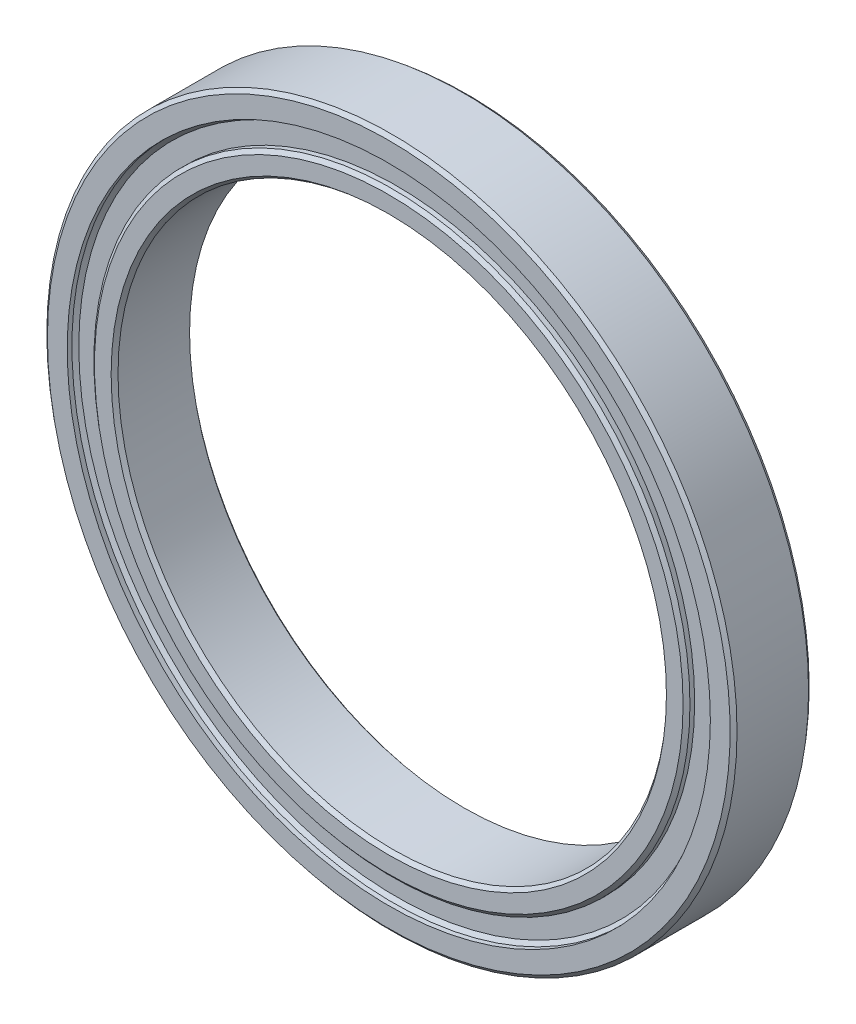
ISO-10303-21;
HEADER;
FILE_DESCRIPTION(('STEP AP214'),'2;1');
FILE_NAME('part.step','',(''),(''),'','','');
FILE_SCHEMA(('AUTOMOTIVE_DESIGN { 1 0 10303 214 1 1 1 1 }'));
ENDSEC;
DATA;
#1=APPLICATION_CONTEXT('core data for automotive mechanical design processes');
#2=APPLICATION_PROTOCOL_DEFINITION('international standard','automotive_design',2000,#1);
#3=PRODUCT_CONTEXT('',#1,'mechanical');
#4=PRODUCT('Part','Part','',(#3));
#5=PRODUCT_RELATED_PRODUCT_CATEGORY('part','',(#4));
#6=PRODUCT_DEFINITION_FORMATION('','',#4);
#7=PRODUCT_DEFINITION_CONTEXT('part definition',#1,'design');
#8=PRODUCT_DEFINITION('design','',#6,#7);
#9=PRODUCT_DEFINITION_SHAPE('','',#8);
#10=(LENGTH_UNIT() NAMED_UNIT(*) SI_UNIT(.MILLI.,.METRE.));
#11=(NAMED_UNIT(*) PLANE_ANGLE_UNIT() SI_UNIT($,.RADIAN.));
#12=(NAMED_UNIT(*) SI_UNIT($,.STERADIAN.) SOLID_ANGLE_UNIT());
#13=UNCERTAINTY_MEASURE_WITH_UNIT(LENGTH_MEASURE(1.E-05),#10,'distance_accuracy_value','');
#14=(GEOMETRIC_REPRESENTATION_CONTEXT(3) GLOBAL_UNCERTAINTY_ASSIGNED_CONTEXT((#13)) GLOBAL_UNIT_ASSIGNED_CONTEXT((#10,
#11,#12)) REPRESENTATION_CONTEXT('',''));
#15=CARTESIAN_POINT('',(0.,0.,0.));
#16=DIRECTION('',(0.,0.,1.));
#17=DIRECTION('',(1.,0.,0.));
#18=AXIS2_PLACEMENT_3D('',#15,#16,#17);
#19=CARTESIAN_POINT('',(0.,0.,0.));
#20=DIRECTION('',(0.,0.,1.));
#21=DIRECTION('',(1.,0.,0.));
#22=AXIS2_PLACEMENT_3D('',#19,#20,#21);
#23=PLANE('',#22);
#24=CARTESIAN_POINT('',(0.,0.,0.));
#25=DIRECTION('',(0.,0.,1.));
#26=DIRECTION('',(1.,0.,0.));
#27=AXIS2_PLACEMENT_3D('',#24,#25,#26);
#28=CIRCLE('',#27,17.7383507185188);
#29=CARTESIAN_POINT('',(17.7383507185188,0.,0.));
#30=VERTEX_POINT('',#29);
#31=EDGE_CURVE('E60',#30,#30,#28,.T.);
#32=ORIENTED_EDGE('',*,*,#31,.T.);
#33=EDGE_LOOP('',(#32));
#34=FACE_BOUND('',#33,.T.);
#35=CARTESIAN_POINT('',(0.,0.,0.));
#36=DIRECTION('',(0.,0.,1.));
#37=DIRECTION('',(1.,0.,0.));
#38=AXIS2_PLACEMENT_3D('',#35,#36,#37);
#39=CIRCLE('',#38,18.8);
#40=CARTESIAN_POINT('',(18.8,0.,0.));
#41=VERTEX_POINT('',#40);
#42=EDGE_CURVE('E63',#41,#41,#39,.F.);
#43=ORIENTED_EDGE('',*,*,#42,.T.);
#44=EDGE_LOOP('',(#43));
#45=FACE_BOUND('',#44,.T.);
#46=ADVANCED_FACE('F33',(#34,#45),#23,.F.);
#47=CARTESIAN_POINT('',(0.,0.,5.));
#48=DIRECTION('',(0.,0.,1.));
#49=DIRECTION('',(1.,0.,0.));
#50=AXIS2_PLACEMENT_3D('',#47,#48,#49);
#51=PLANE('',#50);
#52=CARTESIAN_POINT('',(0.,0.,5.));
#53=DIRECTION('',(0.,0.,1.));
#54=DIRECTION('',(1.,0.,0.));
#55=AXIS2_PLACEMENT_3D('',#52,#53,#54);
#56=CIRCLE('',#55,18.7616492814812);
#57=CARTESIAN_POINT('',(18.7616492814812,0.,5.));
#58=VERTEX_POINT('',#57);
#59=EDGE_CURVE('E84',#58,#58,#56,.T.);
#60=ORIENTED_EDGE('',*,*,#59,.T.);
#61=EDGE_LOOP('',(#60));
#62=FACE_BOUND('',#61,.T.);
#63=CARTESIAN_POINT('',(0.,0.,5.));
#64=DIRECTION('',(0.,0.,1.));
#65=DIRECTION('',(1.,0.,0.));
#66=AXIS2_PLACEMENT_3D('',#63,#64,#65);
#67=CIRCLE('',#66,17.7);
#68=CARTESIAN_POINT('',(17.7,0.,5.));
#69=VERTEX_POINT('',#68);
#70=EDGE_CURVE('E87',#69,#69,#67,.F.);
#71=ORIENTED_EDGE('',*,*,#70,.T.);
#72=EDGE_LOOP('',(#71));
#73=FACE_BOUND('',#72,.T.);
#74=ADVANCED_FACE('F121',(#62,#73),#51,.T.);
#75=CARTESIAN_POINT('',(0.,0.,5.));
#76=DIRECTION('',(0.,0.,1.));
#77=DIRECTION('',(1.,0.,0.));
#78=AXIS2_PLACEMENT_3D('',#75,#76,#77);
#79=CIRCLE('',#78,21.7616492814812);
#80=CARTESIAN_POINT('',(-21.7616492814812,0.,5.));
#81=VERTEX_POINT('',#80);
#82=EDGE_CURVE('E72',#81,#81,#79,.T.);
#83=ORIENTED_EDGE('',*,*,#82,.T.);
#84=EDGE_LOOP('',(#83));
#85=FACE_BOUND('',#84,.T.);
#86=CARTESIAN_POINT('',(0.,0.,5.));
#87=DIRECTION('',(0.,0.,1.));
#88=DIRECTION('',(1.,0.,0.));
#89=AXIS2_PLACEMENT_3D('',#86,#87,#88);
#90=CIRCLE('',#89,20.5);
#91=CARTESIAN_POINT('',(20.5,0.,5.));
#92=VERTEX_POINT('',#91);
#93=EDGE_CURVE('E90',#92,#92,#90,.T.);
#94=ORIENTED_EDGE('',*,*,#93,.F.);
#95=EDGE_LOOP('',(#94));
#96=FACE_BOUND('',#95,.T.);
#97=ADVANCED_FACE('F128',(#85,#96),#51,.T.);
#98=CARTESIAN_POINT('',(0.,0.,0.));
#99=DIRECTION('',(0.,0.,1.));
#100=DIRECTION('',(1.,0.,0.));
#101=AXIS2_PLACEMENT_3D('',#98,#99,#100);
#102=CIRCLE('',#101,20.7383507185188);
#103=CARTESIAN_POINT('',(20.7383507185188,0.,0.));
#104=VERTEX_POINT('',#103);
#105=EDGE_CURVE('E45',#104,#104,#102,.T.);
#106=ORIENTED_EDGE('',*,*,#105,.T.);
#107=EDGE_LOOP('',(#106));
#108=FACE_BOUND('',#107,.T.);
#109=CARTESIAN_POINT('',(0.,0.,0.));
#110=DIRECTION('',(0.,0.,1.));
#111=DIRECTION('',(1.,0.,0.));
#112=AXIS2_PLACEMENT_3D('',#109,#110,#111);
#113=CIRCLE('',#112,21.8);
#114=CARTESIAN_POINT('',(21.8,0.,0.));
#115=VERTEX_POINT('',#114);
#116=EDGE_CURVE('E49',#115,#115,#113,.F.);
#117=ORIENTED_EDGE('',*,*,#116,.T.);
#118=EDGE_LOOP('',(#117));
#119=FACE_BOUND('',#118,.T.);
#120=ADVANCED_FACE('F124',(#108,#119),#23,.F.);
#121=CARTESIAN_POINT('',(0.,0.,5.));
#122=DIRECTION('',(0.,0.,-1.));
#123=DIRECTION('',(-1.,0.,0.));
#124=AXIS2_PLACEMENT_3D('',#121,#122,#123);
#125=CYLINDRICAL_SURFACE('',#124,22.);
#126=CARTESIAN_POINT('',(0.,0.,0.23835071851883));
#127=DIRECTION('',(0.,0.,1.));
#128=DIRECTION('',(1.,0.,0.));
#129=AXIS2_PLACEMENT_3D('',#126,#127,#128);
#130=CIRCLE('',#129,22.);
#131=CARTESIAN_POINT('',(22.,0.,0.23835071851883));
#132=VERTEX_POINT('',#131);
#133=EDGE_CURVE('E10',#132,#132,#130,.T.);
#134=ORIENTED_EDGE('',*,*,#133,.T.);
#135=EDGE_LOOP('',(#134));
#136=FACE_BOUND('',#135,.T.);
#137=CARTESIAN_POINT('',(0.,0.,4.80000000000001));
#138=DIRECTION('',(0.,0.,1.));
#139=DIRECTION('',(1.,0.,0.));
#140=AXIS2_PLACEMENT_3D('',#137,#138,#139);
#141=CIRCLE('',#140,22.);
#142=CARTESIAN_POINT('',(-22.,0.,4.80000000000001));
#143=VERTEX_POINT('',#142);
#144=EDGE_CURVE('E69',#143,#143,#141,.F.);
#145=ORIENTED_EDGE('',*,*,#144,.T.);
#146=EDGE_LOOP('',(#145));
#147=FACE_BOUND('',#146,.T.);
#148=ADVANCED_FACE('F134',(#136,#147),#125,.T.);
#149=CARTESIAN_POINT('',(0.,0.,5.));
#150=DIRECTION('',(0.,0.,-1.));
#151=DIRECTION('',(-1.,0.,0.));
#152=AXIS2_PLACEMENT_3D('',#149,#150,#151);
#153=CYLINDRICAL_SURFACE('',#152,17.5);
#154=CARTESIAN_POINT('',(0.,0.,0.199999999999997));
#155=DIRECTION('',(0.,0.,1.));
#156=DIRECTION('',(1.,0.,0.));
#157=AXIS2_PLACEMENT_3D('',#154,#155,#156);
#158=CIRCLE('',#157,17.5);
#159=CARTESIAN_POINT('',(17.5,0.,0.199999999999997));
#160=VERTEX_POINT('',#159);
#161=EDGE_CURVE('E57',#160,#160,#158,.F.);
#162=ORIENTED_EDGE('',*,*,#161,.T.);
#163=EDGE_LOOP('',(#162));
#164=FACE_BOUND('',#163,.T.);
#165=CARTESIAN_POINT('',(0.,0.,4.76164928148117));
#166=DIRECTION('',(0.,0.,1.));
#167=DIRECTION('',(1.,0.,0.));
#168=AXIS2_PLACEMENT_3D('',#165,#166,#167);
#169=CIRCLE('',#168,17.5);
#170=CARTESIAN_POINT('',(17.5,0.,4.76164928148117));
#171=VERTEX_POINT('',#170);
#172=EDGE_CURVE('E66',#171,#171,#169,.T.);
#173=ORIENTED_EDGE('',*,*,#172,.T.);
#174=EDGE_LOOP('',(#173));
#175=FACE_BOUND('',#174,.T.);
#176=ADVANCED_FACE('F140',(#164,#175),#153,.F.);
#177=CARTESIAN_POINT('',(0.,0.,4.5));
#178=DIRECTION('',(0.,0.,1.));
#179=DIRECTION('',(1.,0.,0.));
#180=AXIS2_PLACEMENT_3D('',#177,#178,#179);
#181=CYLINDRICAL_SURFACE('',#180,20.5);
#182=CARTESIAN_POINT('',(0.,0.,4.7));
#183=DIRECTION('',(0.,0.,1.));
#184=DIRECTION('',(1.,0.,0.));
#185=AXIS2_PLACEMENT_3D('',#182,#183,#184);
#186=CIRCLE('',#185,20.5);
#187=CARTESIAN_POINT('',(20.5,0.,4.7));
#188=VERTEX_POINT('',#187);
#189=EDGE_CURVE('E75',#188,#188,#186,.F.);
#190=ORIENTED_EDGE('',*,*,#189,.T.);
#191=EDGE_LOOP('',(#190));
#192=FACE_BOUND('',#191,.T.);
#193=ORIENTED_EDGE('',*,*,#93,.T.);
#194=EDGE_LOOP('',(#193));
#195=FACE_BOUND('',#194,.T.);
#196=ADVANCED_FACE('F212',(#192,#195),#181,.F.);
#197=CARTESIAN_POINT('',(0.,0.,4.5));
#198=DIRECTION('',(0.,0.,1.));
#199=DIRECTION('',(1.,0.,0.));
#200=AXIS2_PLACEMENT_3D('',#197,#198,#199);
#201=PLANE('',#200);
#202=CARTESIAN_POINT('',(0.,0.,4.5));
#203=DIRECTION('',(0.,0.,1.));
#204=DIRECTION('',(1.,0.,0.));
#205=AXIS2_PLACEMENT_3D('',#202,#203,#204);
#206=CIRCLE('',#205,20.2616492814812);
#207=CARTESIAN_POINT('',(20.2616492814812,0.,4.5));
#208=VERTEX_POINT('',#207);
#209=EDGE_CURVE('E78',#208,#208,#206,.T.);
#210=ORIENTED_EDGE('',*,*,#209,.T.);
#211=EDGE_LOOP('',(#210));
#212=FACE_BOUND('',#211,.T.);
#213=CARTESIAN_POINT('',(0.,0.,4.5));
#214=DIRECTION('',(0.,0.,1.));
#215=DIRECTION('',(1.,0.,0.));
#216=AXIS2_PLACEMENT_3D('',#213,#214,#215);
#217=CIRCLE('',#216,19.);
#218=CARTESIAN_POINT('',(19.,0.,4.5));
#219=VERTEX_POINT('',#218);
#220=EDGE_CURVE('E93',#219,#219,#217,.T.);
#221=ORIENTED_EDGE('',*,*,#220,.F.);
#222=EDGE_LOOP('',(#221));
#223=FACE_BOUND('',#222,.T.);
#224=ADVANCED_FACE('F200',(#212,#223),#201,.T.);
#225=CARTESIAN_POINT('',(0.,0.,4.5));
#226=DIRECTION('',(0.,0.,1.));
#227=DIRECTION('',(1.,0.,0.));
#228=AXIS2_PLACEMENT_3D('',#225,#226,#227);
#229=CYLINDRICAL_SURFACE('',#228,19.);
#230=CARTESIAN_POINT('',(0.,0.,4.8));
#231=DIRECTION('',(0.,0.,1.));
#232=DIRECTION('',(1.,0.,0.));
#233=AXIS2_PLACEMENT_3D('',#230,#231,#232);
#234=CIRCLE('',#233,19.);
#235=CARTESIAN_POINT('',(19.,0.,4.8));
#236=VERTEX_POINT('',#235);
#237=EDGE_CURVE('E81',#236,#236,#234,.F.);
#238=ORIENTED_EDGE('',*,*,#237,.T.);
#239=EDGE_LOOP('',(#238));
#240=FACE_BOUND('',#239,.T.);
#241=ORIENTED_EDGE('',*,*,#220,.T.);
#242=EDGE_LOOP('',(#241));
#243=FACE_BOUND('',#242,.T.);
#244=ADVANCED_FACE('F195',(#240,#243),#229,.T.);
#245=CARTESIAN_POINT('',(0.,0.,5.));
#246=DIRECTION('',(0.,0.,-1.));
#247=DIRECTION('',(-1.,0.,0.));
#248=AXIS2_PLACEMENT_3D('',#245,#246,#247);
#249=CONICAL_SURFACE('',#248,18.7616492814812,0.872664625997171);
#250=ORIENTED_EDGE('',*,*,#237,.F.);
#251=EDGE_LOOP('',(#250));
#252=FACE_BOUND('',#251,.T.);
#253=ORIENTED_EDGE('',*,*,#59,.F.);
#254=EDGE_LOOP('',(#253));
#255=FACE_BOUND('',#254,.T.);
#256=ADVANCED_FACE('F190',(#252,#255),#249,.T.);
#257=CARTESIAN_POINT('',(0.,0.,4.5));
#258=DIRECTION('',(0.,0.,1.));
#259=DIRECTION('',(1.,0.,0.));
#260=AXIS2_PLACEMENT_3D('',#257,#258,#259);
#261=CONICAL_SURFACE('',#260,20.2616492814812,0.872664625997171);
#262=ORIENTED_EDGE('',*,*,#189,.F.);
#263=EDGE_LOOP('',(#262));
#264=FACE_BOUND('',#263,.T.);
#265=ORIENTED_EDGE('',*,*,#209,.F.);
#266=EDGE_LOOP('',(#265));
#267=FACE_BOUND('',#266,.T.);
#268=ADVANCED_FACE('F183',(#264,#267),#261,.F.);
#269=CARTESIAN_POINT('',(0.,0.,5.));
#270=DIRECTION('',(0.,0.,-1.));
#271=DIRECTION('',(-1.,0.,0.));
#272=AXIS2_PLACEMENT_3D('',#269,#270,#271);
#273=CONICAL_SURFACE('',#272,21.7616492814812,0.872664625997189);
#274=CARTESIAN_POINT('',(-22.,0.,4.80000000000001));
#275=CARTESIAN_POINT('',(-21.9975171800154,0.,4.80208333333335));
#276=CARTESIAN_POINT('',(-21.9950343600309,0.,4.80416666666668));
#277=CARTESIAN_POINT('',(-21.9900687200617,0.,4.80833333333334));
#278=CARTESIAN_POINT('',(-21.9875859000771,0.,4.81041666666668));
#279=CARTESIAN_POINT('',(-21.982620260108,0.,4.81458333333334));
#280=CARTESIAN_POINT('',(-21.9801374401234,0.,4.81666666666668));
#281=CARTESIAN_POINT('',(-21.9751718001543,0.,4.82083333333334));
#282=CARTESIAN_POINT('',(-21.9726889801697,0.,4.82291666666668));
#283=CARTESIAN_POINT('',(-21.9677233402006,0.,4.82708333333334));
#284=CARTESIAN_POINT('',(-21.965240520216,0.,4.82916666666668));
#285=CARTESIAN_POINT('',(-21.9602748802469,0.,4.83333333333334));
#286=CARTESIAN_POINT('',(-21.9577920602623,0.,4.83541666666668));
#287=CARTESIAN_POINT('',(-21.9528264202931,0.,4.83958333333334));
#288=CARTESIAN_POINT('',(-21.9503436003086,0.,4.84166666666668));
#289=CARTESIAN_POINT('',(-21.9453779603394,0.,4.84583333333334));
#290=CARTESIAN_POINT('',(-21.9428951403549,0.,4.84791666666668));
#291=CARTESIAN_POINT('',(-21.9379295003857,0.,4.85208333333334));
#292=CARTESIAN_POINT('',(-21.9354466804011,0.,4.85416666666667));
#293=CARTESIAN_POINT('',(-21.930481040432,0.,4.85833333333334));
#294=CARTESIAN_POINT('',(-21.9279982204474,0.,4.86041666666667));
#295=CARTESIAN_POINT('',(-21.9230325804783,0.,4.86458333333334));
#296=CARTESIAN_POINT('',(-21.9205497604937,0.,4.86666666666667));
#297=CARTESIAN_POINT('',(-21.9155841205246,0.,4.87083333333334));
#298=CARTESIAN_POINT('',(-21.91310130054,0.,4.87291666666667));
#299=CARTESIAN_POINT('',(-21.9081356605709,0.,4.87708333333334));
#300=CARTESIAN_POINT('',(-21.9056528405863,0.,4.87916666666667));
#301=CARTESIAN_POINT('',(-21.9006872006171,0.,4.88333333333334));
#302=CARTESIAN_POINT('',(-21.8982043806326,0.,4.88541666666667));
#303=CARTESIAN_POINT('',(-21.8932387406634,0.,4.88958333333334));
#304=CARTESIAN_POINT('',(-21.8907559206789,0.,4.89166666666667));
#305=CARTESIAN_POINT('',(-21.8857902807097,0.,4.89583333333334));
#306=CARTESIAN_POINT('',(-21.8833074607251,0.,4.89791666666667));
#307=CARTESIAN_POINT('',(-21.878341820756,0.,4.90208333333334));
#308=CARTESIAN_POINT('',(-21.8758590007714,0.,4.90416666666667));
#309=CARTESIAN_POINT('',(-21.8708933608023,0.,4.90833333333334));
#310=CARTESIAN_POINT('',(-21.8684105408177,0.,4.91041666666667));
#311=CARTESIAN_POINT('',(-21.8634449008486,0.,4.91458333333334));
#312=CARTESIAN_POINT('',(-21.860962080864,0.,4.91666666666667));
#313=CARTESIAN_POINT('',(-21.8559964408949,0.,4.92083333333334));
#314=CARTESIAN_POINT('',(-21.8535136209103,0.,4.92291666666667));
#315=CARTESIAN_POINT('',(-21.8485479809412,0.,4.92708333333334));
#316=CARTESIAN_POINT('',(-21.8460651609566,0.,4.92916666666667));
#317=CARTESIAN_POINT('',(-21.8410995209874,0.,4.93333333333334));
#318=CARTESIAN_POINT('',(-21.8386167010029,0.,4.93541666666667));
#319=CARTESIAN_POINT('',(-21.8336510610337,0.,4.93958333333334));
#320=CARTESIAN_POINT('',(-21.8311682410492,0.,4.94166666666667));
#321=CARTESIAN_POINT('',(-21.82620260108,0.,4.94583333333334));
#322=CARTESIAN_POINT('',(-21.8237197810954,0.,4.94791666666667));
#323=CARTESIAN_POINT('',(-21.8187541411263,0.,4.95208333333334));
#324=CARTESIAN_POINT('',(-21.8162713211417,0.,4.95416666666667));
#325=CARTESIAN_POINT('',(-21.8113056811726,0.,4.95833333333334));
#326=CARTESIAN_POINT('',(-21.808822861188,0.,4.96041666666667));
#327=CARTESIAN_POINT('',(-21.8038572212189,0.,4.96458333333333));
#328=CARTESIAN_POINT('',(-21.8013744012343,0.,4.96666666666667));
#329=CARTESIAN_POINT('',(-21.7964087612652,0.,4.97083333333334));
#330=CARTESIAN_POINT('',(-21.7939259412806,0.,4.97291666666667));
#331=CARTESIAN_POINT('',(-21.7889603013114,0.,4.97708333333333));
#332=CARTESIAN_POINT('',(-21.7864774813269,0.,4.97916666666667));
#333=CARTESIAN_POINT('',(-21.7815118413577,0.,4.98333333333333));
#334=CARTESIAN_POINT('',(-21.7790290213732,0.,4.98541666666667));
#335=CARTESIAN_POINT('',(-21.774063381404,0.,4.98958333333333));
#336=CARTESIAN_POINT('',(-21.7715805614194,0.,4.99166666666667));
#337=CARTESIAN_POINT('',(-21.7666149214503,0.,4.99583333333333));
#338=CARTESIAN_POINT('',(-21.7641321014657,0.,4.99791666666667));
#339=CARTESIAN_POINT('',(-21.7616492814812,0.,5.));
#340=B_SPLINE_CURVE_WITH_KNOTS('',3,(#274,#275,#276,#277,#278,#279,#280,#281,#282,#283,#284,
#285,#286,#287,#288,#289,#290,#291,#292,#293,#294,#295,#296,#297,#298,#299,#300,#301,#302,#303,
#304,#305,#306,#307,#308,#309,#310,#311,#312,#313,#314,#315,#316,#317,#318,#319,#320,#321,#322,
#323,#324,#325,#326,#327,#328,#329,#330,#331,#332,#333,#334,#335,#336,#337,#338,#339),
.UNSPECIFIED.,.F.,.F.,(4,2,2,2,2,2,2,2,2,2,2,2,2,2,2,2,2,2,2,2,2,2,2,2,2,2,2,2,2,2,2,2,4),(0.,
0.00972327391787742,0.0194465478357548,0.0291698217536302,0.0388930956715076,0.048616369589385,
0.058339643507263,0.0680629174251404,0.0777861913430184,0.0875094652608958,0.0972327391787732,
0.106956013096649,0.116679287014526,0.126402560932403,0.136125834850281,0.145849108768159,
0.155572382686037,0.165295656603914,0.175018930521792,0.184742204439667,0.194465478357544,
0.204188752275422,0.2139120261933,0.223635300111177,0.233358574029055,0.243081847946932,
0.25280512186481,0.262528395782685,0.272251669700563,0.28197494361844,0.291698217536318,
0.301421491454195,0.311144765372073),.UNSPECIFIED.);
#341=EDGE_CURVE('BSEAM176',#143,#81,#340,.T.);
#342=ORIENTED_EDGE('',*,*,#144,.F.);
#343=ORIENTED_EDGE('',*,*,#82,.F.);
#344=ORIENTED_EDGE('',*,*,#341,.T.);
#345=ORIENTED_EDGE('',*,*,#341,.F.);
#346=EDGE_LOOP('',(#342,#344,#343,#345));
#347=FACE_BOUND('',#346,.T.);
#348=ADVANCED_FACE('F176',(#347),#273,.T.);
#349=CARTESIAN_POINT('',(0.,0.,4.76164928148117));
#350=DIRECTION('',(0.,0.,1.));
#351=DIRECTION('',(1.,0.,0.));
#352=AXIS2_PLACEMENT_3D('',#349,#350,#351);
#353=CONICAL_SURFACE('',#352,17.5,0.698131700797746);
#354=ORIENTED_EDGE('',*,*,#70,.F.);
#355=EDGE_LOOP('',(#354));
#356=FACE_BOUND('',#355,.T.);
#357=ORIENTED_EDGE('',*,*,#172,.F.);
#358=EDGE_LOOP('',(#357));
#359=FACE_BOUND('',#358,.T.);
#360=ADVANCED_FACE('F170',(#356,#359),#353,.F.);
#361=CARTESIAN_POINT('',(0.,0.,0.5));
#362=DIRECTION('',(0.,0.,-1.));
#363=DIRECTION('',(1.,0.,0.));
#364=AXIS2_PLACEMENT_3D('',#361,#362,#363);
#365=PLANE('',#364);
#366=CARTESIAN_POINT('',(0.,0.,0.5));
#367=DIRECTION('',(0.,0.,1.));
#368=DIRECTION('',(1.,0.,0.));
#369=AXIS2_PLACEMENT_3D('',#366,#367,#368);
#370=CIRCLE('',#369,20.5);
#371=CARTESIAN_POINT('',(20.5,0.,0.5));
#372=VERTEX_POINT('',#371);
#373=EDGE_CURVE('E96',#372,#372,#370,.T.);
#374=ORIENTED_EDGE('',*,*,#373,.F.);
#375=EDGE_LOOP('',(#374));
#376=FACE_BOUND('',#375,.T.);
#377=CARTESIAN_POINT('',(0.,0.,0.5));
#378=DIRECTION('',(0.,0.,1.));
#379=DIRECTION('',(1.,0.,0.));
#380=AXIS2_PLACEMENT_3D('',#377,#378,#379);
#381=CIRCLE('',#380,19.);
#382=CARTESIAN_POINT('',(19.,0.,0.5));
#383=VERTEX_POINT('',#382);
#384=EDGE_CURVE('E99',#383,#383,#381,.T.);
#385=ORIENTED_EDGE('',*,*,#384,.T.);
#386=EDGE_LOOP('',(#385));
#387=FACE_BOUND('',#386,.T.);
#388=ADVANCED_FACE('F103',(#376,#387),#365,.T.);
#389=CARTESIAN_POINT('',(0.,0.,0.5));
#390=DIRECTION('',(0.,0.,-1.));
#391=DIRECTION('',(-1.,0.,0.));
#392=AXIS2_PLACEMENT_3D('',#389,#390,#391);
#393=CYLINDRICAL_SURFACE('',#392,20.5);
#394=CARTESIAN_POINT('',(0.,0.,0.199999999999995));
#395=DIRECTION('',(0.,0.,1.));
#396=DIRECTION('',(1.,0.,0.));
#397=AXIS2_PLACEMENT_3D('',#394,#395,#396);
#398=CIRCLE('',#397,20.5);
#399=CARTESIAN_POINT('',(20.5,0.,0.199999999999995));
#400=VERTEX_POINT('',#399);
#401=EDGE_CURVE('E41',#400,#400,#398,.F.);
#402=ORIENTED_EDGE('',*,*,#401,.T.);
#403=EDGE_LOOP('',(#402));
#404=FACE_BOUND('',#403,.T.);
#405=ORIENTED_EDGE('',*,*,#373,.T.);
#406=EDGE_LOOP('',(#405));
#407=FACE_BOUND('',#406,.T.);
#408=ADVANCED_FACE('F108',(#404,#407),#393,.F.);
#409=CARTESIAN_POINT('',(0.,0.,0.5));
#410=DIRECTION('',(0.,0.,-1.));
#411=DIRECTION('',(-1.,0.,0.));
#412=AXIS2_PLACEMENT_3D('',#409,#410,#411);
#413=CYLINDRICAL_SURFACE('',#412,19.);
#414=CARTESIAN_POINT('',(0.,0.,0.23835071851883));
#415=DIRECTION('',(0.,0.,1.));
#416=DIRECTION('',(1.,0.,0.));
#417=AXIS2_PLACEMENT_3D('',#414,#415,#416);
#418=CIRCLE('',#417,19.);
#419=CARTESIAN_POINT('',(19.,0.,0.23835071851883));
#420=VERTEX_POINT('',#419);
#421=EDGE_CURVE('E54',#420,#420,#418,.T.);
#422=ORIENTED_EDGE('',*,*,#421,.T.);
#423=EDGE_LOOP('',(#422));
#424=FACE_BOUND('',#423,.T.);
#425=ORIENTED_EDGE('',*,*,#384,.F.);
#426=EDGE_LOOP('',(#425));
#427=FACE_BOUND('',#426,.T.);
#428=ADVANCED_FACE('F105',(#424,#427),#413,.T.);
#429=CARTESIAN_POINT('',(0.,0.,0.));
#430=DIRECTION('',(0.,0.,-1.));
#431=DIRECTION('',(-1.,0.,0.));
#432=AXIS2_PLACEMENT_3D('',#429,#430,#431);
#433=CONICAL_SURFACE('',#432,17.7383507185188,0.872664625997168);
#434=ORIENTED_EDGE('',*,*,#161,.F.);
#435=EDGE_LOOP('',(#434));
#436=FACE_BOUND('',#435,.T.);
#437=ORIENTED_EDGE('',*,*,#31,.F.);
#438=EDGE_LOOP('',(#437));
#439=FACE_BOUND('',#438,.T.);
#440=ADVANCED_FACE('F107',(#436,#439),#433,.F.);
#441=CARTESIAN_POINT('',(0.,0.,0.23835071851883));
#442=DIRECTION('',(0.,0.,1.));
#443=DIRECTION('',(1.,0.,0.));
#444=AXIS2_PLACEMENT_3D('',#441,#442,#443);
#445=CONICAL_SURFACE('',#444,19.,0.698131700797746);
#446=ORIENTED_EDGE('',*,*,#42,.F.);
#447=EDGE_LOOP('',(#446));
#448=FACE_BOUND('',#447,.T.);
#449=ORIENTED_EDGE('',*,*,#421,.F.);
#450=EDGE_LOOP('',(#449));
#451=FACE_BOUND('',#450,.T.);
#452=ADVANCED_FACE('F115',(#448,#451),#445,.T.);
#453=CARTESIAN_POINT('',(0.,0.,0.));
#454=DIRECTION('',(0.,0.,-1.));
#455=DIRECTION('',(-1.,0.,0.));
#456=AXIS2_PLACEMENT_3D('',#453,#454,#455);
#457=CONICAL_SURFACE('',#456,20.7383507185188,0.872664625997179);
#458=ORIENTED_EDGE('',*,*,#401,.F.);
#459=EDGE_LOOP('',(#458));
#460=FACE_BOUND('',#459,.T.);
#461=ORIENTED_EDGE('',*,*,#105,.F.);
#462=EDGE_LOOP('',(#461));
#463=FACE_BOUND('',#462,.T.);
#464=ADVANCED_FACE('F148',(#460,#463),#457,.F.);
#465=CARTESIAN_POINT('',(0.,0.,0.23835071851883));
#466=DIRECTION('',(0.,0.,1.));
#467=DIRECTION('',(1.,0.,0.));
#468=AXIS2_PLACEMENT_3D('',#465,#466,#467);
#469=CONICAL_SURFACE('',#468,22.,0.698131700797746);
#470=ORIENTED_EDGE('',*,*,#116,.F.);
#471=EDGE_LOOP('',(#470));
#472=FACE_BOUND('',#471,.T.);
#473=ORIENTED_EDGE('',*,*,#133,.F.);
#474=EDGE_LOOP('',(#473));
#475=FACE_BOUND('',#474,.T.);
#476=ADVANCED_FACE('F36',(#472,#475),#469,.T.);
#477=CLOSED_SHELL('',(#46,#74,#97,#120,#148,#176,#196,#224,#244,#256,#268,#348,#360,#388,#408,
#428,#440,#452,#464,#476));
#478=MANIFOLD_SOLID_BREP('B2',#477);
#479=ADVANCED_BREP_SHAPE_REPRESENTATION('',(#18,#478),#14);
#480=SHAPE_DEFINITION_REPRESENTATION(#9,#479);
ENDSEC;
END-ISO-10303-21;
